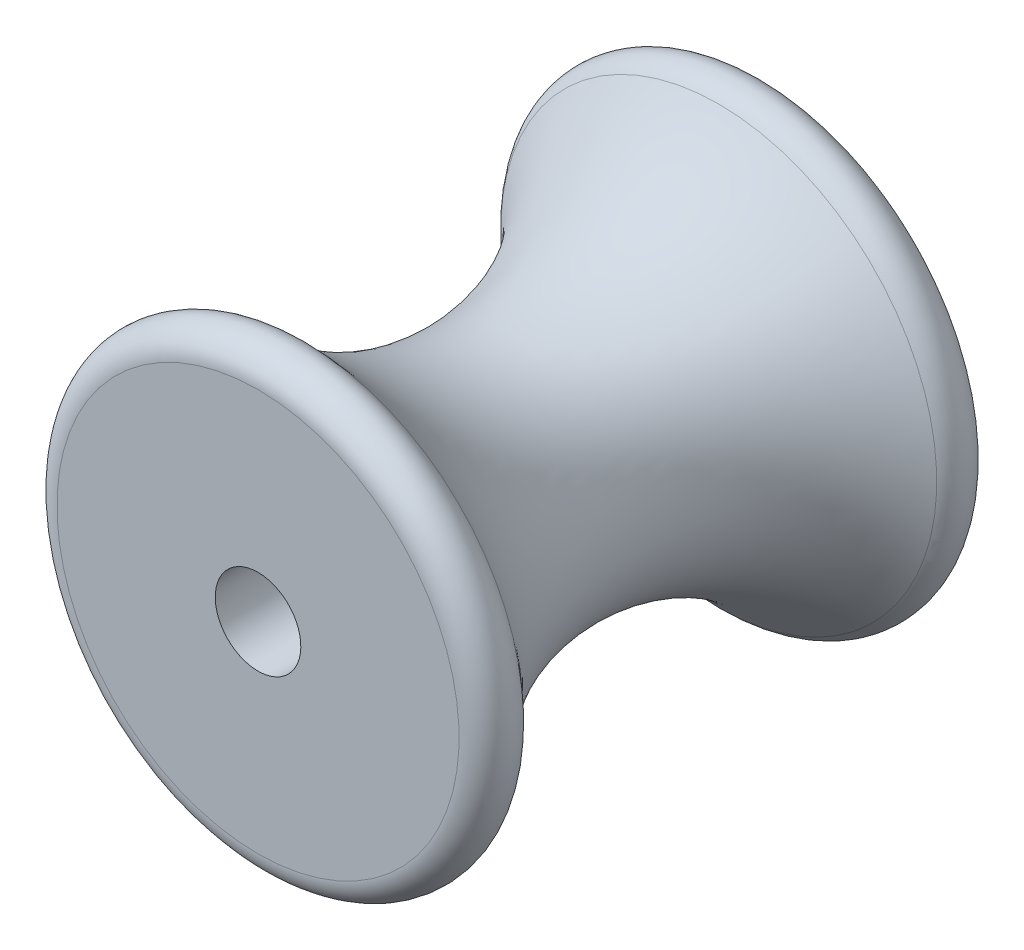
ISO-10303-21;
HEADER;
FILE_DESCRIPTION(('STEP AP214'),'2;1');
FILE_NAME('part.step','',(''),(''),'','','');
FILE_SCHEMA(('AUTOMOTIVE_DESIGN { 1 0 10303 214 1 1 1 1 }'));
ENDSEC;
DATA;
#1=APPLICATION_CONTEXT('core data for automotive mechanical design processes');
#2=APPLICATION_PROTOCOL_DEFINITION('international standard','automotive_design',2000,#1);
#3=PRODUCT_CONTEXT('',#1,'mechanical');
#4=PRODUCT('Part','Part','',(#3));
#5=PRODUCT_RELATED_PRODUCT_CATEGORY('part','',(#4));
#6=PRODUCT_DEFINITION_FORMATION('','',#4);
#7=PRODUCT_DEFINITION_CONTEXT('part definition',#1,'design');
#8=PRODUCT_DEFINITION('design','',#6,#7);
#9=PRODUCT_DEFINITION_SHAPE('','',#8);
#10=(LENGTH_UNIT() NAMED_UNIT(*) SI_UNIT(.MILLI.,.METRE.));
#11=(NAMED_UNIT(*) PLANE_ANGLE_UNIT() SI_UNIT($,.RADIAN.));
#12=(NAMED_UNIT(*) SI_UNIT($,.STERADIAN.) SOLID_ANGLE_UNIT());
#13=UNCERTAINTY_MEASURE_WITH_UNIT(LENGTH_MEASURE(1.E-05),#10,'distance_accuracy_value','');
#14=(GEOMETRIC_REPRESENTATION_CONTEXT(3) GLOBAL_UNCERTAINTY_ASSIGNED_CONTEXT((#13)) GLOBAL_UNIT_ASSIGNED_CONTEXT((#10,
#11,#12)) REPRESENTATION_CONTEXT('',''));
#15=CARTESIAN_POINT('',(0.,0.,0.));
#16=DIRECTION('',(0.,0.,1.));
#17=DIRECTION('',(1.,0.,0.));
#18=AXIS2_PLACEMENT_3D('',#15,#16,#17);
#19=CARTESIAN_POINT('',(0.,0.,-9.5));
#20=DIRECTION('',(0.,0.,-1.));
#21=DIRECTION('',(0.,1.,0.));
#22=AXIS2_PLACEMENT_3D('',#19,#20,#21);
#23=PLANE('',#22);
#24=CARTESIAN_POINT('',(0.,0.,-9.5));
#25=DIRECTION('',(0.,0.,-1.));
#26=DIRECTION('',(0.,1.,0.));
#27=AXIS2_PLACEMENT_3D('',#24,#25,#26);
#28=CIRCLE('',#27,7.51787997811553);
#29=CARTESIAN_POINT('',(0.,7.51787997811553,-9.5));
#30=VERTEX_POINT('',#29);
#31=EDGE_CURVE('E10',#30,#30,#28,.T.);
#32=ORIENTED_EDGE('',*,*,#31,.T.);
#33=EDGE_LOOP('',(#32));
#34=FACE_BOUND('',#33,.T.);
#35=CARTESIAN_POINT('',(0.,0.,-9.5));
#36=DIRECTION('',(0.,0.,-1.));
#37=DIRECTION('',(0.,1.,0.));
#38=AXIS2_PLACEMENT_3D('',#35,#36,#37);
#39=CIRCLE('',#38,1.60000000000001);
#40=CARTESIAN_POINT('',(0.,1.60000000000001,-9.5));
#41=VERTEX_POINT('',#40);
#42=EDGE_CURVE('E62',#41,#41,#39,.T.);
#43=ORIENTED_EDGE('',*,*,#42,.F.);
#44=EDGE_LOOP('',(#43));
#45=FACE_BOUND('',#44,.T.);
#46=ADVANCED_FACE('F39',(#34,#45),#23,.T.);
#47=CARTESIAN_POINT('',(0.,0.,0.));
#48=DIRECTION('',(0.,0.,-1.));
#49=DIRECTION('',(0.,1.,0.));
#50=AXIS2_PLACEMENT_3D('',#47,#48,#49);
#51=TOROIDAL_SURFACE('',#50,14.5,10.);
#52=CARTESIAN_POINT('',(0.,0.,7.72727272727272));
#53=DIRECTION('',(0.,0.,-1.));
#54=DIRECTION('',(0.,1.,0.));
#55=AXIS2_PLACEMENT_3D('',#52,#53,#54);
#56=CIRCLE('',#55,8.15261816192322);
#57=CARTESIAN_POINT('',(0.,8.15261816192321,7.72727272727272));
#58=VERTEX_POINT('',#57);
#59=EDGE_CURVE('E50',#58,#58,#56,.T.);
#60=ORIENTED_EDGE('',*,*,#59,.T.);
#61=EDGE_LOOP('',(#60));
#62=FACE_BOUND('',#61,.T.);
#63=CARTESIAN_POINT('',(0.,0.,-7.72727272727273));
#64=DIRECTION('',(0.,0.,1.));
#65=DIRECTION('',(0.,-1.,0.));
#66=AXIS2_PLACEMENT_3D('',#63,#64,#65);
#67=CIRCLE('',#66,8.15261816192321);
#68=CARTESIAN_POINT('',(0.,-8.15261816192321,-7.72727272727273));
#69=VERTEX_POINT('',#68);
#70=EDGE_CURVE('E54',#69,#69,#67,.T.);
#71=ORIENTED_EDGE('',*,*,#70,.T.);
#72=EDGE_LOOP('',(#71));
#73=FACE_BOUND('',#72,.T.);
#74=ADVANCED_FACE('F69',(#62,#73),#51,.F.);
#75=CARTESIAN_POINT('',(0.,0.,9.49999999999999));
#76=DIRECTION('',(0.,0.,-1.));
#77=DIRECTION('',(0.,1.,0.));
#78=AXIS2_PLACEMENT_3D('',#75,#76,#77);
#79=PLANE('',#78);
#80=CARTESIAN_POINT('',(0.,0.,9.49999999999999));
#81=DIRECTION('',(0.,0.,-1.));
#82=DIRECTION('',(0.,1.,0.));
#83=AXIS2_PLACEMENT_3D('',#80,#81,#82);
#84=CIRCLE('',#83,7.51787997811554);
#85=CARTESIAN_POINT('',(0.,7.51787997811553,9.5));
#86=VERTEX_POINT('',#85);
#87=EDGE_CURVE('E46',#86,#86,#84,.F.);
#88=ORIENTED_EDGE('',*,*,#87,.T.);
#89=EDGE_LOOP('',(#88));
#90=FACE_BOUND('',#89,.T.);
#91=CARTESIAN_POINT('',(0.,0.,9.49999999999999));
#92=DIRECTION('',(0.,0.,-1.));
#93=DIRECTION('',(0.,1.,0.));
#94=AXIS2_PLACEMENT_3D('',#91,#92,#93);
#95=CIRCLE('',#94,1.60000000000001);
#96=CARTESIAN_POINT('',(0.,1.6,9.49999999999999));
#97=VERTEX_POINT('',#96);
#98=EDGE_CURVE('E59',#97,#97,#95,.T.);
#99=ORIENTED_EDGE('',*,*,#98,.T.);
#100=EDGE_LOOP('',(#99));
#101=FACE_BOUND('',#100,.T.);
#102=ADVANCED_FACE('F75',(#90,#101),#79,.F.);
#103=CARTESIAN_POINT('',(0.,0.,-9.99999999999999));
#104=DIRECTION('',(0.,0.,-1.));
#105=DIRECTION('',(0.,1.,0.));
#106=AXIS2_PLACEMENT_3D('',#103,#104,#105);
#107=CYLINDRICAL_SURFACE('',#106,1.60000000000001);
#108=ORIENTED_EDGE('',*,*,#98,.F.);
#109=EDGE_LOOP('',(#108));
#110=FACE_BOUND('',#109,.T.);
#111=ORIENTED_EDGE('',*,*,#42,.T.);
#112=EDGE_LOOP('',(#111));
#113=FACE_BOUND('',#112,.T.);
#114=ADVANCED_FACE('F66',(#110,#113),#107,.F.);
#115=CARTESIAN_POINT('',(0.,0.,8.49999999999999));
#116=DIRECTION('',(0.,0.,1.));
#117=DIRECTION('',(0.,-1.,0.));
#118=AXIS2_PLACEMENT_3D('',#115,#116,#117);
#119=TOROIDAL_SURFACE('',#118,7.51787997811554,1.);
#120=ORIENTED_EDGE('',*,*,#87,.F.);
#121=EDGE_LOOP('',(#120));
#122=FACE_BOUND('',#121,.T.);
#123=ORIENTED_EDGE('',*,*,#59,.F.);
#124=EDGE_LOOP('',(#123));
#125=FACE_BOUND('',#124,.T.);
#126=ADVANCED_FACE('F79',(#122,#125),#119,.T.);
#127=CARTESIAN_POINT('',(0.,0.,-8.5));
#128=DIRECTION('',(0.,0.,1.));
#129=DIRECTION('',(0.,-1.,0.));
#130=AXIS2_PLACEMENT_3D('',#127,#128,#129);
#131=TOROIDAL_SURFACE('',#130,7.51787997811553,1.);
#132=ORIENTED_EDGE('',*,*,#70,.F.);
#133=EDGE_LOOP('',(#132));
#134=FACE_BOUND('',#133,.T.);
#135=ORIENTED_EDGE('',*,*,#31,.F.);
#136=EDGE_LOOP('',(#135));
#137=FACE_BOUND('',#136,.T.);
#138=ADVANCED_FACE('F41',(#134,#137),#131,.T.);
#139=CLOSED_SHELL('',(#46,#74,#102,#114,#126,#138));
#140=MANIFOLD_SOLID_BREP('B2',#139);
#141=ADVANCED_BREP_SHAPE_REPRESENTATION('',(#18,#140),#14);
#142=SHAPE_DEFINITION_REPRESENTATION(#9,#141);
ENDSEC;
END-ISO-10303-21;
